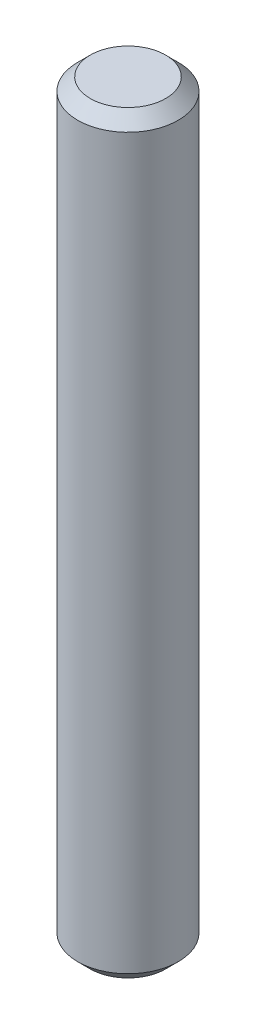
ISO-10303-21;
HEADER;
FILE_DESCRIPTION(('STEP AP214'),'2;1');
FILE_NAME('part.step','',(''),(''),'','','');
FILE_SCHEMA(('AUTOMOTIVE_DESIGN { 1 0 10303 214 1 1 1 1 }'));
ENDSEC;
DATA;
#1=APPLICATION_CONTEXT('core data for automotive mechanical design processes');
#2=APPLICATION_PROTOCOL_DEFINITION('international standard','automotive_design',2000,#1);
#3=PRODUCT_CONTEXT('',#1,'mechanical');
#4=PRODUCT('Part','Part','',(#3));
#5=PRODUCT_RELATED_PRODUCT_CATEGORY('part','',(#4));
#6=PRODUCT_DEFINITION_FORMATION('','',#4);
#7=PRODUCT_DEFINITION_CONTEXT('part definition',#1,'design');
#8=PRODUCT_DEFINITION('design','',#6,#7);
#9=PRODUCT_DEFINITION_SHAPE('','',#8);
#10=(LENGTH_UNIT() NAMED_UNIT(*) SI_UNIT(.MILLI.,.METRE.));
#11=(NAMED_UNIT(*) PLANE_ANGLE_UNIT() SI_UNIT($,.RADIAN.));
#12=(NAMED_UNIT(*) SI_UNIT($,.STERADIAN.) SOLID_ANGLE_UNIT());
#13=UNCERTAINTY_MEASURE_WITH_UNIT(LENGTH_MEASURE(1.E-05),#10,'distance_accuracy_value','');
#14=(GEOMETRIC_REPRESENTATION_CONTEXT(3) GLOBAL_UNCERTAINTY_ASSIGNED_CONTEXT((#13)) GLOBAL_UNIT_ASSIGNED_CONTEXT((#10,
#11,#12)) REPRESENTATION_CONTEXT('',''));
#15=CARTESIAN_POINT('',(0.,0.,0.));
#16=DIRECTION('',(0.,0.,1.));
#17=DIRECTION('',(1.,0.,0.));
#18=AXIS2_PLACEMENT_3D('',#15,#16,#17);
#19=CARTESIAN_POINT('',(0.,15.,0.));
#20=DIRECTION('',(0.,-1.,0.));
#21=DIRECTION('',(0.,0.,-1.));
#22=AXIS2_PLACEMENT_3D('',#19,#20,#21);
#23=CYLINDRICAL_SURFACE('',#22,2.);
#24=CARTESIAN_POINT('',(0.,-14.5,0.));
#25=DIRECTION('',(0.,1.,0.));
#26=DIRECTION('',(0.,0.,1.));
#27=AXIS2_PLACEMENT_3D('',#24,#25,#26);
#28=CIRCLE('',#27,2.);
#29=CARTESIAN_POINT('',(0.,-14.5,2.));
#30=VERTEX_POINT('',#29);
#31=EDGE_CURVE('E51',#30,#30,#28,.T.);
#32=ORIENTED_EDGE('',*,*,#31,.T.);
#33=EDGE_LOOP('',(#32));
#34=FACE_BOUND('',#33,.T.);
#35=CARTESIAN_POINT('',(0.,14.5,0.));
#36=DIRECTION('',(0.,1.,0.));
#37=DIRECTION('',(0.,0.,1.));
#38=AXIS2_PLACEMENT_3D('',#35,#36,#37);
#39=CIRCLE('',#38,2.);
#40=CARTESIAN_POINT('',(0.,14.5,2.));
#41=VERTEX_POINT('',#40);
#42=EDGE_CURVE('E55',#41,#41,#39,.F.);
#43=ORIENTED_EDGE('',*,*,#42,.T.);
#44=EDGE_LOOP('',(#43));
#45=FACE_BOUND('',#44,.T.);
#46=ADVANCED_FACE('F39',(#34,#45),#23,.T.);
#47=CARTESIAN_POINT('',(0.,15.,0.));
#48=DIRECTION('',(0.,1.,0.));
#49=DIRECTION('',(0.,0.,1.));
#50=AXIS2_PLACEMENT_3D('',#47,#48,#49);
#51=PLANE('',#50);
#52=CARTESIAN_POINT('',(0.,15.,0.));
#53=DIRECTION('',(0.,1.,0.));
#54=DIRECTION('',(0.,0.,1.));
#55=AXIS2_PLACEMENT_3D('',#52,#53,#54);
#56=CIRCLE('',#55,1.5);
#57=CARTESIAN_POINT('',(0.,15.,1.5));
#58=VERTEX_POINT('',#57);
#59=EDGE_CURVE('E10',#58,#58,#56,.T.);
#60=ORIENTED_EDGE('',*,*,#59,.T.);
#61=EDGE_LOOP('',(#60));
#62=FACE_BOUND('',#61,.T.);
#63=ADVANCED_FACE('F71',(#62),#51,.T.);
#64=CARTESIAN_POINT('',(0.,-15.,0.));
#65=DIRECTION('',(0.,1.,0.));
#66=DIRECTION('',(0.,0.,1.));
#67=AXIS2_PLACEMENT_3D('',#64,#65,#66);
#68=PLANE('',#67);
#69=CARTESIAN_POINT('',(0.,-15.,0.));
#70=DIRECTION('',(0.,1.,0.));
#71=DIRECTION('',(0.,0.,1.));
#72=AXIS2_PLACEMENT_3D('',#69,#70,#71);
#73=CIRCLE('',#72,1.5);
#74=CARTESIAN_POINT('',(0.,-15.,1.5));
#75=VERTEX_POINT('',#74);
#76=EDGE_CURVE('E47',#75,#75,#73,.F.);
#77=ORIENTED_EDGE('',*,*,#76,.T.);
#78=EDGE_LOOP('',(#77));
#79=FACE_BOUND('',#78,.T.);
#80=ADVANCED_FACE('F68',(#79),#68,.F.);
#81=CARTESIAN_POINT('',(0.,-14.5,0.));
#82=DIRECTION('',(0.,1.,0.));
#83=DIRECTION('',(0.,0.,1.));
#84=AXIS2_PLACEMENT_3D('',#81,#82,#83);
#85=CONICAL_SURFACE('',#84,2.,0.78539816339745);
#86=ORIENTED_EDGE('',*,*,#76,.F.);
#87=EDGE_LOOP('',(#86));
#88=FACE_BOUND('',#87,.T.);
#89=ORIENTED_EDGE('',*,*,#31,.F.);
#90=EDGE_LOOP('',(#89));
#91=FACE_BOUND('',#90,.T.);
#92=ADVANCED_FACE('F64',(#88,#91),#85,.T.);
#93=CARTESIAN_POINT('',(0.,15.,0.));
#94=DIRECTION('',(0.,-1.,0.));
#95=DIRECTION('',(0.,0.,-1.));
#96=AXIS2_PLACEMENT_3D('',#93,#94,#95);
#97=CONICAL_SURFACE('',#96,1.5,0.785398163397448);
#98=ORIENTED_EDGE('',*,*,#42,.F.);
#99=EDGE_LOOP('',(#98));
#100=FACE_BOUND('',#99,.T.);
#101=ORIENTED_EDGE('',*,*,#59,.F.);
#102=EDGE_LOOP('',(#101));
#103=FACE_BOUND('',#102,.T.);
#104=ADVANCED_FACE('F42',(#100,#103),#97,.T.);
#105=CLOSED_SHELL('',(#46,#63,#80,#92,#104));
#106=MANIFOLD_SOLID_BREP('B2',#105);
#107=ADVANCED_BREP_SHAPE_REPRESENTATION('',(#18,#106),#14);
#108=SHAPE_DEFINITION_REPRESENTATION(#9,#107);
ENDSEC;
END-ISO-10303-21;
